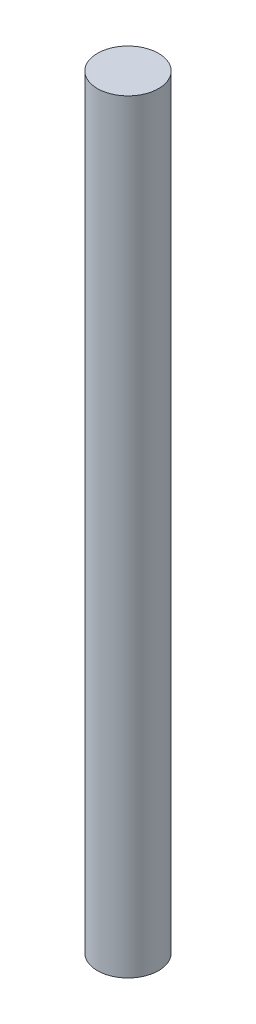
ISO-10303-21;
HEADER;
FILE_DESCRIPTION(('STEP AP214'),'2;1');
FILE_NAME('part.step','',(''),(''),'','','');
FILE_SCHEMA(('AUTOMOTIVE_DESIGN { 1 0 10303 214 1 1 1 1 }'));
ENDSEC;
DATA;
#1=APPLICATION_CONTEXT('core data for automotive mechanical design processes');
#2=APPLICATION_PROTOCOL_DEFINITION('international standard','automotive_design',2000,#1);
#3=PRODUCT_CONTEXT('',#1,'mechanical');
#4=PRODUCT('Part','Part','',(#3));
#5=PRODUCT_RELATED_PRODUCT_CATEGORY('part','',(#4));
#6=PRODUCT_DEFINITION_FORMATION('','',#4);
#7=PRODUCT_DEFINITION_CONTEXT('part definition',#1,'design');
#8=PRODUCT_DEFINITION('design','',#6,#7);
#9=PRODUCT_DEFINITION_SHAPE('','',#8);
#10=(LENGTH_UNIT() NAMED_UNIT(*) SI_UNIT(.MILLI.,.METRE.));
#11=(NAMED_UNIT(*) PLANE_ANGLE_UNIT() SI_UNIT($,.RADIAN.));
#12=(NAMED_UNIT(*) SI_UNIT($,.STERADIAN.) SOLID_ANGLE_UNIT());
#13=UNCERTAINTY_MEASURE_WITH_UNIT(LENGTH_MEASURE(1.E-05),#10,'distance_accuracy_value','');
#14=(GEOMETRIC_REPRESENTATION_CONTEXT(3) GLOBAL_UNCERTAINTY_ASSIGNED_CONTEXT((#13)) GLOBAL_UNIT_ASSIGNED_CONTEXT((#10,
#11,#12)) REPRESENTATION_CONTEXT('',''));
#15=CARTESIAN_POINT('',(0.,0.,0.));
#16=DIRECTION('',(0.,0.,1.));
#17=DIRECTION('',(1.,0.,0.));
#18=AXIS2_PLACEMENT_3D('',#15,#16,#17);
#19=CARTESIAN_POINT('',(0.,200.,0.));
#20=DIRECTION('',(0.,-1.,0.));
#21=DIRECTION('',(0.,0.,-1.));
#22=AXIS2_PLACEMENT_3D('',#19,#20,#21);
#23=CYLINDRICAL_SURFACE('',#22,8.);
#24=CARTESIAN_POINT('',(0.,200.,0.));
#25=DIRECTION('',(0.,1.,0.));
#26=DIRECTION('',(0.,0.,1.));
#27=AXIS2_PLACEMENT_3D('',#24,#25,#26);
#28=CIRCLE('',#27,8.);
#29=CARTESIAN_POINT('',(0.,200.,8.));
#30=VERTEX_POINT('',#29);
#31=EDGE_CURVE('E10',#30,#30,#28,.T.);
#32=ORIENTED_EDGE('',*,*,#31,.F.);
#33=EDGE_LOOP('',(#32));
#34=FACE_BOUND('',#33,.T.);
#35=CARTESIAN_POINT('',(0.,0.,0.));
#36=DIRECTION('',(0.,1.,0.));
#37=DIRECTION('',(0.,0.,1.));
#38=AXIS2_PLACEMENT_3D('',#35,#36,#37);
#39=CIRCLE('',#38,8.);
#40=CARTESIAN_POINT('',(0.,0.,8.));
#41=VERTEX_POINT('',#40);
#42=EDGE_CURVE('E34',#41,#41,#39,.T.);
#43=ORIENTED_EDGE('',*,*,#42,.T.);
#44=EDGE_LOOP('',(#43));
#45=FACE_BOUND('',#44,.T.);
#46=ADVANCED_FACE('F31',(#34,#45),#23,.T.);
#47=CARTESIAN_POINT('',(0.,200.,0.));
#48=DIRECTION('',(0.,1.,0.));
#49=DIRECTION('',(0.,0.,1.));
#50=AXIS2_PLACEMENT_3D('',#47,#48,#49);
#51=PLANE('',#50);
#52=ORIENTED_EDGE('',*,*,#31,.T.);
#53=EDGE_LOOP('',(#52));
#54=FACE_BOUND('',#53,.T.);
#55=ADVANCED_FACE('F46',(#54),#51,.T.);
#56=CARTESIAN_POINT('',(0.,0.,0.));
#57=DIRECTION('',(0.,1.,0.));
#58=DIRECTION('',(0.,0.,1.));
#59=AXIS2_PLACEMENT_3D('',#56,#57,#58);
#60=PLANE('',#59);
#61=ORIENTED_EDGE('',*,*,#42,.F.);
#62=EDGE_LOOP('',(#61));
#63=FACE_BOUND('',#62,.T.);
#64=ADVANCED_FACE('F44',(#63),#60,.F.);
#65=CLOSED_SHELL('',(#46,#55,#64));
#66=MANIFOLD_SOLID_BREP('B2',#65);
#67=ADVANCED_BREP_SHAPE_REPRESENTATION('',(#18,#66),#14);
#68=SHAPE_DEFINITION_REPRESENTATION(#9,#67);
ENDSEC;
END-ISO-10303-21;
